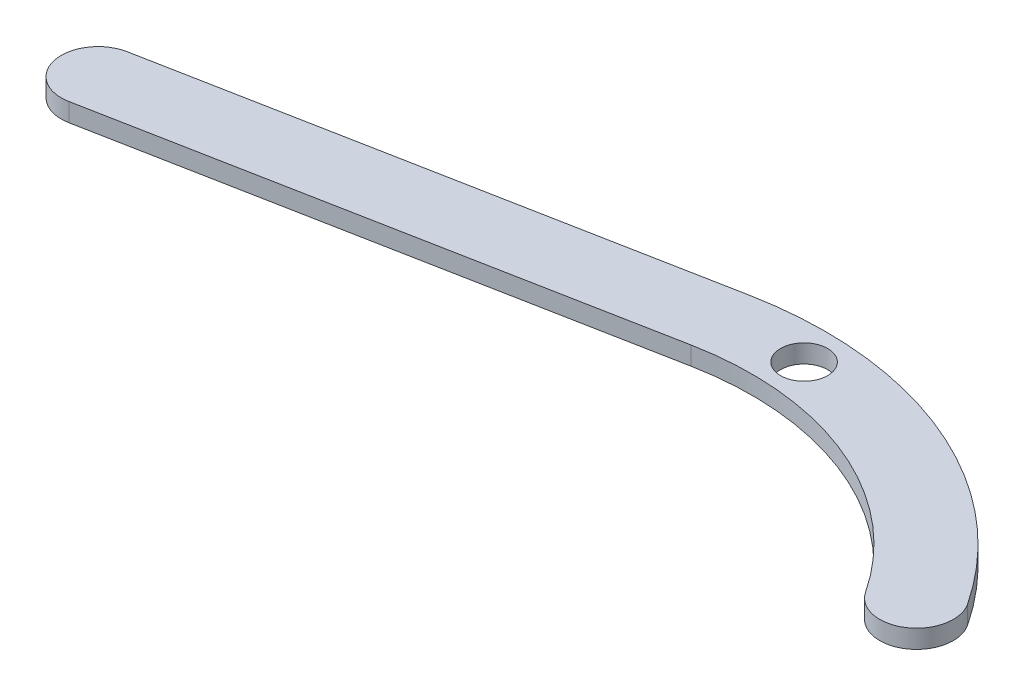
ISO-10303-21;
HEADER;
FILE_DESCRIPTION(('STEP AP214'),'2;1');
FILE_NAME('part.step','',(''),(''),'','','');
FILE_SCHEMA(('AUTOMOTIVE_DESIGN { 1 0 10303 214 1 1 1 1 }'));
ENDSEC;
DATA;
#1=APPLICATION_CONTEXT('core data for automotive mechanical design processes');
#2=APPLICATION_PROTOCOL_DEFINITION('international standard','automotive_design',2000,#1);
#3=PRODUCT_CONTEXT('',#1,'mechanical');
#4=PRODUCT('Part','Part','',(#3));
#5=PRODUCT_RELATED_PRODUCT_CATEGORY('part','',(#4));
#6=PRODUCT_DEFINITION_FORMATION('','',#4);
#7=PRODUCT_DEFINITION_CONTEXT('part definition',#1,'design');
#8=PRODUCT_DEFINITION('design','',#6,#7);
#9=PRODUCT_DEFINITION_SHAPE('','',#8);
#10=(LENGTH_UNIT() NAMED_UNIT(*) SI_UNIT(.MILLI.,.METRE.));
#11=(NAMED_UNIT(*) PLANE_ANGLE_UNIT() SI_UNIT($,.RADIAN.));
#12=(NAMED_UNIT(*) SI_UNIT($,.STERADIAN.) SOLID_ANGLE_UNIT());
#13=UNCERTAINTY_MEASURE_WITH_UNIT(LENGTH_MEASURE(1.E-05),#10,'distance_accuracy_value','');
#14=(GEOMETRIC_REPRESENTATION_CONTEXT(3) GLOBAL_UNCERTAINTY_ASSIGNED_CONTEXT((#13)) GLOBAL_UNIT_ASSIGNED_CONTEXT((#10,
#11,#12)) REPRESENTATION_CONTEXT('',''));
#15=CARTESIAN_POINT('',(0.,0.,0.));
#16=DIRECTION('',(0.,0.,1.));
#17=DIRECTION('',(1.,0.,0.));
#18=AXIS2_PLACEMENT_3D('',#15,#16,#17);
#19=CARTESIAN_POINT('',(0.0861770971338329,1.5875,10.3436386714056));
#20=DIRECTION('',(0.,-1.,0.));
#21=DIRECTION('',(0.,0.,-1.));
#22=AXIS2_PLACEMENT_3D('',#19,#20,#21);
#23=CYLINDRICAL_SURFACE('',#22,3.175);
#24=CARTESIAN_POINT('',(0.0861770971338329,0.,10.3436386714056));
#25=DIRECTION('',(0.,1.,0.));
#26=DIRECTION('',(0.,0.,1.));
#27=AXIS2_PLACEMENT_3D('',#24,#25,#26);
#28=CIRCLE('',#27,3.175);
#29=CARTESIAN_POINT('',(-0.512568562595019,0.,7.22560585647955));
#30=VERTEX_POINT('',#29);
#31=CARTESIAN_POINT('',(0.684922756862685,0.,13.4616714863317));
#32=VERTEX_POINT('',#31);
#33=EDGE_CURVE('E150',#30,#32,#28,.T.);
#34=ORIENTED_EDGE('',*,*,#33,.T.);
#35=DIRECTION('',(0.,-1.,0.));
#36=VECTOR('',#35,1.);
#37=CARTESIAN_POINT('',(0.684922756862685,1.5875,13.4616714863317));
#38=LINE('',#37,#36);
#39=CARTESIAN_POINT('',(0.684922756862685,1.5875,13.4616714863317));
#40=VERTEX_POINT('',#39);
#41=EDGE_CURVE('E11',#40,#32,#38,.T.);
#42=ORIENTED_EDGE('',*,*,#41,.F.);
#43=CARTESIAN_POINT('',(0.0861770971338329,1.5875,10.3436386714056));
#44=DIRECTION('',(0.,1.,0.));
#45=DIRECTION('',(0.,0.,1.));
#46=AXIS2_PLACEMENT_3D('',#43,#44,#45);
#47=CIRCLE('',#46,3.175);
#48=CARTESIAN_POINT('',(-0.512568562595019,1.5875,7.22560585647955));
#49=VERTEX_POINT('',#48);
#50=EDGE_CURVE('E167',#49,#40,#47,.T.);
#51=ORIENTED_EDGE('',*,*,#50,.F.);
#52=DIRECTION('',(0.,-1.,0.));
#53=VECTOR('',#52,1.);
#54=CARTESIAN_POINT('',(-0.512568562595019,1.5875,7.22560585647955));
#55=LINE('',#54,#53);
#56=EDGE_CURVE('E146',#49,#30,#55,.T.);
#57=ORIENTED_EDGE('',*,*,#56,.T.);
#58=EDGE_LOOP('',(#34,#42,#51,#57));
#59=FACE_BOUND('',#58,.T.);
#60=ADVANCED_FACE('F49',(#59),#23,.T.);
#61=CARTESIAN_POINT('',(0.684922756862685,1.5875,13.4616714863317));
#62=DIRECTION('',(-0.18858131015082,0.,-0.982057579504277));
#63=DIRECTION('',(-0.982057579504278,0.,0.18858131015082));
#64=AXIS2_PLACEMENT_3D('',#61,#62,#63);
#65=PLANE('',#64);
#66=DIRECTION('',(0.982057579504278,0.,-0.18858131015082));
#67=VECTOR('',#66,1.);
#68=CARTESIAN_POINT('',(0.684922756862685,0.,13.4616714863317));
#69=LINE('',#68,#67);
#70=CARTESIAN_POINT('',(45.7336684165915,0.,4.81110796087021));
#71=VERTEX_POINT('',#70);
#72=EDGE_CURVE('E154',#32,#71,#69,.T.);
#73=ORIENTED_EDGE('',*,*,#72,.T.);
#74=DIRECTION('',(0.,-1.,0.));
#75=VECTOR('',#74,1.);
#76=CARTESIAN_POINT('',(45.7336684165915,1.5875,4.81110796087021));
#77=LINE('',#76,#75);
#78=CARTESIAN_POINT('',(45.7336684165915,1.5875,4.81110796087021));
#79=VERTEX_POINT('',#78);
#80=EDGE_CURVE('E58',#79,#71,#77,.T.);
#81=ORIENTED_EDGE('',*,*,#80,.F.);
#82=DIRECTION('',(0.982057579504278,0.,-0.18858131015082));
#83=VECTOR('',#82,1.);
#84=CARTESIAN_POINT('',(0.684922756862685,1.5875,13.4616714863317));
#85=LINE('',#84,#83);
#86=EDGE_CURVE('E113',#40,#79,#85,.T.);
#87=ORIENTED_EDGE('',*,*,#86,.F.);
#88=ORIENTED_EDGE('',*,*,#41,.T.);
#89=EDGE_LOOP('',(#73,#81,#87,#88));
#90=FACE_BOUND('',#89,.T.);
#91=ADVANCED_FACE('F196',(#90),#65,.F.);
#92=CARTESIAN_POINT('',(50.5236336944224,1.5875,29.7553704802789));
#93=DIRECTION('',(0.,-1.,0.));
#94=DIRECTION('',(0.,0.,-1.));
#95=AXIS2_PLACEMENT_3D('',#92,#93,#94);
#96=CYLINDRICAL_SURFACE('',#95,25.4);
#97=CARTESIAN_POINT('',(50.5236336944224,0.,29.7553704802789));
#98=DIRECTION('',(0.,-1.,0.));
#99=DIRECTION('',(0.,0.,1.));
#100=AXIS2_PLACEMENT_3D('',#97,#98,#99);
#101=CIRCLE('',#100,25.4);
#102=CARTESIAN_POINT('',(71.717083543045,0.,15.7554532121692));
#103=VERTEX_POINT('',#102);
#104=EDGE_CURVE('E158',#71,#103,#101,.T.);
#105=ORIENTED_EDGE('',*,*,#104,.T.);
#106=DIRECTION('',(0.,-1.,0.));
#107=VECTOR('',#106,1.);
#108=CARTESIAN_POINT('',(71.717083543045,1.5875,15.7554532121692));
#109=LINE('',#108,#107);
#110=CARTESIAN_POINT('',(71.717083543045,1.5875,15.7554532121692));
#111=VERTEX_POINT('',#110);
#112=EDGE_CURVE('E139',#111,#103,#109,.T.);
#113=ORIENTED_EDGE('',*,*,#112,.F.);
#114=CARTESIAN_POINT('',(50.5236336944224,1.5875,29.7553704802789));
#115=DIRECTION('',(0.,-1.,0.));
#116=DIRECTION('',(0.,0.,1.));
#117=AXIS2_PLACEMENT_3D('',#114,#115,#116);
#118=CIRCLE('',#117,25.4);
#119=EDGE_CURVE('E128',#79,#111,#118,.T.);
#120=ORIENTED_EDGE('',*,*,#119,.F.);
#121=ORIENTED_EDGE('',*,*,#80,.T.);
#122=EDGE_LOOP('',(#105,#113,#120,#121));
#123=FACE_BOUND('',#122,.T.);
#124=ADVANCED_FACE('F177',(#123),#96,.F.);
#125=CARTESIAN_POINT('',(74.3662647741229,1.5875,14.0054635536554));
#126=DIRECTION('',(0.,-1.,0.));
#127=DIRECTION('',(0.,0.,-1.));
#128=AXIS2_PLACEMENT_3D('',#125,#126,#127);
#129=CYLINDRICAL_SURFACE('',#128,3.175);
#130=CARTESIAN_POINT('',(74.3662647741229,0.,14.0054635536554));
#131=DIRECTION('',(0.,1.,0.));
#132=DIRECTION('',(0.,0.,1.));
#133=AXIS2_PLACEMENT_3D('',#130,#131,#132);
#134=CIRCLE('',#133,3.175);
#135=CARTESIAN_POINT('',(77.0154460052007,0.,12.2554738951417));
#136=VERTEX_POINT('',#135);
#137=EDGE_CURVE('E137',#103,#136,#134,.T.);
#138=ORIENTED_EDGE('',*,*,#137,.T.);
#139=DIRECTION('',(0.,-1.,0.));
#140=VECTOR('',#139,1.);
#141=CARTESIAN_POINT('',(77.0154460052007,1.5875,12.2554738951417));
#142=LINE('',#141,#140);
#143=CARTESIAN_POINT('',(77.0154460052007,1.5875,12.2554738951417));
#144=VERTEX_POINT('',#143);
#145=EDGE_CURVE('E134',#144,#136,#142,.T.);
#146=ORIENTED_EDGE('',*,*,#145,.F.);
#147=CARTESIAN_POINT('',(74.3662647741229,1.5875,14.0054635536554));
#148=DIRECTION('',(0.,1.,0.));
#149=DIRECTION('',(0.,0.,1.));
#150=AXIS2_PLACEMENT_3D('',#147,#148,#149);
#151=CIRCLE('',#150,3.175);
#152=EDGE_CURVE('E122',#111,#144,#151,.T.);
#153=ORIENTED_EDGE('',*,*,#152,.F.);
#154=ORIENTED_EDGE('',*,*,#112,.T.);
#155=EDGE_LOOP('',(#138,#146,#153,#154));
#156=FACE_BOUND('',#155,.T.);
#157=ADVANCED_FACE('F135',(#156),#129,.T.);
#158=CARTESIAN_POINT('',(50.5236336944224,1.5875,29.7553704802789));
#159=DIRECTION('',(0.,-1.,0.));
#160=DIRECTION('',(0.,0.,-1.));
#161=AXIS2_PLACEMENT_3D('',#158,#159,#160);
#162=CYLINDRICAL_SURFACE('',#161,31.75);
#163=CARTESIAN_POINT('',(50.5236336944224,0.,29.7553704802789));
#164=DIRECTION('',(0.,1.,0.));
#165=DIRECTION('',(0.,0.,1.));
#166=AXIS2_PLACEMENT_3D('',#163,#164,#165);
#167=CIRCLE('',#166,31.75);
#168=CARTESIAN_POINT('',(44.5361770971338,0.,-1.42495766898195));
#169=VERTEX_POINT('',#168);
#170=EDGE_CURVE('E98',#136,#169,#167,.T.);
#171=ORIENTED_EDGE('',*,*,#170,.T.);
#172=DIRECTION('',(0.,-1.,0.));
#173=VECTOR('',#172,1.);
#174=CARTESIAN_POINT('',(44.5361770971338,1.5875,-1.42495766898195));
#175=LINE('',#174,#173);
#176=CARTESIAN_POINT('',(44.5361770971338,1.5875,-1.42495766898195));
#177=VERTEX_POINT('',#176);
#178=EDGE_CURVE('E140',#177,#169,#175,.T.);
#179=ORIENTED_EDGE('',*,*,#178,.F.);
#180=CARTESIAN_POINT('',(50.5236336944224,1.5875,29.7553704802789));
#181=DIRECTION('',(0.,1.,0.));
#182=DIRECTION('',(0.,0.,1.));
#183=AXIS2_PLACEMENT_3D('',#180,#181,#182);
#184=CIRCLE('',#183,31.75);
#185=EDGE_CURVE('E126',#144,#177,#184,.T.);
#186=ORIENTED_EDGE('',*,*,#185,.F.);
#187=ORIENTED_EDGE('',*,*,#145,.T.);
#188=EDGE_LOOP('',(#171,#179,#186,#187));
#189=FACE_BOUND('',#188,.T.);
#190=ADVANCED_FACE('F142',(#189),#162,.T.);
#191=CARTESIAN_POINT('',(44.5361770971338,1.5875,-1.42495766898195));
#192=DIRECTION('',(0.188581310150819,0.,0.982057579504277));
#193=DIRECTION('',(0.982057579504278,0.,-0.18858131015082));
#194=AXIS2_PLACEMENT_3D('',#191,#192,#193);
#195=PLANE('',#194);
#196=DIRECTION('',(-0.982057579504278,0.,0.188581310150819));
#197=VECTOR('',#196,1.);
#198=CARTESIAN_POINT('',(44.5361770971338,0.,-1.42495766898195));
#199=LINE('',#198,#197);
#200=EDGE_CURVE('E105',#169,#30,#199,.T.);
#201=ORIENTED_EDGE('',*,*,#200,.T.);
#202=ORIENTED_EDGE('',*,*,#56,.F.);
#203=DIRECTION('',(-0.982057579504278,0.,0.188581310150819));
#204=VECTOR('',#203,1.);
#205=CARTESIAN_POINT('',(44.5361770971338,1.5875,-1.42495766898195));
#206=LINE('',#205,#204);
#207=EDGE_CURVE('E69',#177,#49,#206,.T.);
#208=ORIENTED_EDGE('',*,*,#207,.F.);
#209=ORIENTED_EDGE('',*,*,#178,.T.);
#210=EDGE_LOOP('',(#201,#202,#208,#209));
#211=FACE_BOUND('',#210,.T.);
#212=ADVANCED_FACE('F184',(#211),#195,.F.);
#213=CARTESIAN_POINT('',(0.0861770971338329,1.5875,10.3436386714056));
#214=DIRECTION('',(0.,1.,0.));
#215=DIRECTION('',(0.,0.,1.));
#216=AXIS2_PLACEMENT_3D('',#213,#214,#215);
#217=PLANE('',#216);
#218=CARTESIAN_POINT('',(51.8712335941183,1.5875,1.21256320218005));
#219=DIRECTION('',(0.,1.,0.));
#220=DIRECTION('',(0.,0.,1.));
#221=AXIS2_PLACEMENT_3D('',#218,#219,#220);
#222=CIRCLE('',#221,2.032);
#223=CARTESIAN_POINT('',(51.8712335941183,1.5875,3.24456320218005));
#224=VERTEX_POINT('',#223);
#225=EDGE_CURVE('E272',#224,#224,#222,.T.);
#226=ORIENTED_EDGE('',*,*,#225,.F.);
#227=EDGE_LOOP('',(#226));
#228=FACE_BOUND('',#227,.T.);
#229=ORIENTED_EDGE('',*,*,#50,.T.);
#230=ORIENTED_EDGE('',*,*,#86,.T.);
#231=ORIENTED_EDGE('',*,*,#119,.T.);
#232=ORIENTED_EDGE('',*,*,#152,.T.);
#233=ORIENTED_EDGE('',*,*,#185,.T.);
#234=ORIENTED_EDGE('',*,*,#207,.T.);
#235=EDGE_LOOP('',(#229,#230,#231,#232,#233,#234));
#236=FACE_BOUND('',#235,.T.);
#237=ADVANCED_FACE('F124',(#228,#236),#217,.T.);
#238=CARTESIAN_POINT('',(0.0861770971338329,0.,10.3436386714056));
#239=DIRECTION('',(0.,1.,0.));
#240=DIRECTION('',(0.,0.,1.));
#241=AXIS2_PLACEMENT_3D('',#238,#239,#240);
#242=PLANE('',#241);
#243=CARTESIAN_POINT('',(51.8712335941183,0.,1.21256320218005));
#244=DIRECTION('',(0.,1.,0.));
#245=DIRECTION('',(0.,0.,1.));
#246=AXIS2_PLACEMENT_3D('',#243,#244,#245);
#247=CIRCLE('',#246,2.032);
#248=CARTESIAN_POINT('',(51.8712335941183,0.,3.24456320218005));
#249=VERTEX_POINT('',#248);
#250=EDGE_CURVE('E155',#249,#249,#247,.T.);
#251=ORIENTED_EDGE('',*,*,#250,.T.);
#252=EDGE_LOOP('',(#251));
#253=FACE_BOUND('',#252,.T.);
#254=ORIENTED_EDGE('',*,*,#33,.F.);
#255=ORIENTED_EDGE('',*,*,#200,.F.);
#256=ORIENTED_EDGE('',*,*,#170,.F.);
#257=ORIENTED_EDGE('',*,*,#137,.F.);
#258=ORIENTED_EDGE('',*,*,#104,.F.);
#259=ORIENTED_EDGE('',*,*,#72,.F.);
#260=EDGE_LOOP('',(#254,#255,#256,#257,#258,#259));
#261=FACE_BOUND('',#260,.T.);
#262=ADVANCED_FACE('F180',(#253,#261),#242,.F.);
#263=CARTESIAN_POINT('',(51.8712335941183,0.,1.21256320218005));
#264=DIRECTION('',(0.,1.,0.));
#265=DIRECTION('',(0.,0.,1.));
#266=AXIS2_PLACEMENT_3D('',#263,#264,#265);
#267=CYLINDRICAL_SURFACE('',#266,2.032);
#268=ORIENTED_EDGE('',*,*,#250,.F.);
#269=EDGE_LOOP('',(#268));
#270=FACE_BOUND('',#269,.T.);
#271=ORIENTED_EDGE('',*,*,#225,.T.);
#272=EDGE_LOOP('',(#271));
#273=FACE_BOUND('',#272,.T.);
#274=ADVANCED_FACE('F235',(#270,#273),#267,.F.);
#275=CLOSED_SHELL('',(#60,#91,#124,#157,#190,#212,#237,#262,#274));
#276=MANIFOLD_SOLID_BREP('B2',#275);
#277=ADVANCED_BREP_SHAPE_REPRESENTATION('',(#18,#276),#14);
#278=SHAPE_DEFINITION_REPRESENTATION(#9,#277);
ENDSEC;
END-ISO-10303-21;
